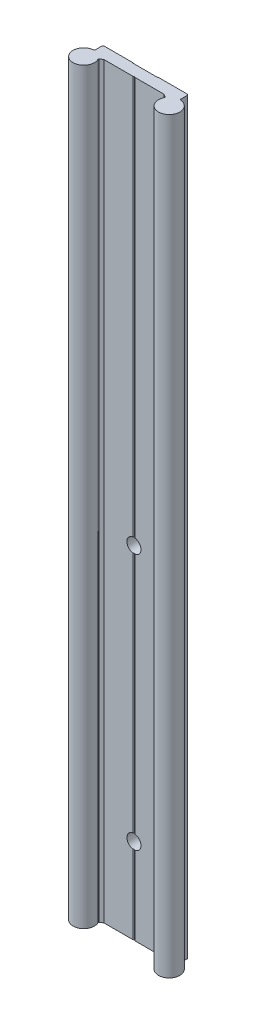
ISO-10303-21;
HEADER;
FILE_DESCRIPTION(('STEP AP214'),'2;1');
FILE_NAME('part.step','',(''),(''),'','','');
FILE_SCHEMA(('AUTOMOTIVE_DESIGN { 1 0 10303 214 1 1 1 1 }'));
ENDSEC;
DATA;
#1=APPLICATION_CONTEXT('core data for automotive mechanical design processes');
#2=APPLICATION_PROTOCOL_DEFINITION('international standard','automotive_design',2000,#1);
#3=PRODUCT_CONTEXT('',#1,'mechanical');
#4=PRODUCT('Part','Part','',(#3));
#5=PRODUCT_RELATED_PRODUCT_CATEGORY('part','',(#4));
#6=PRODUCT_DEFINITION_FORMATION('','',#4);
#7=PRODUCT_DEFINITION_CONTEXT('part definition',#1,'design');
#8=PRODUCT_DEFINITION('design','',#6,#7);
#9=PRODUCT_DEFINITION_SHAPE('','',#8);
#10=(LENGTH_UNIT() NAMED_UNIT(*) SI_UNIT(.MILLI.,.METRE.));
#11=(NAMED_UNIT(*) PLANE_ANGLE_UNIT() SI_UNIT($,.RADIAN.));
#12=(NAMED_UNIT(*) SI_UNIT($,.STERADIAN.) SOLID_ANGLE_UNIT());
#13=UNCERTAINTY_MEASURE_WITH_UNIT(LENGTH_MEASURE(1.E-05),#10,'distance_accuracy_value','');
#14=(GEOMETRIC_REPRESENTATION_CONTEXT(3) GLOBAL_UNCERTAINTY_ASSIGNED_CONTEXT((#13)) GLOBAL_UNIT_ASSIGNED_CONTEXT((#10,
#11,#12)) REPRESENTATION_CONTEXT('',''));
#15=CARTESIAN_POINT('',(0.,0.,0.));
#16=DIRECTION('',(0.,0.,1.));
#17=DIRECTION('',(1.,0.,0.));
#18=AXIS2_PLACEMENT_3D('',#15,#16,#17);
#19=CARTESIAN_POINT('',(19.75,0.,0.25));
#20=DIRECTION('',(0.707106781186548,0.,-0.707106781186548));
#21=DIRECTION('',(-0.707106781186548,0.,-0.707106781186548));
#22=AXIS2_PLACEMENT_3D('',#19,#20,#21);
#23=PLANE('',#22);
#24=DIRECTION('',(-0.707106781186548,0.,-0.707106781186548));
#25=VECTOR('',#24,1.);
#26=CARTESIAN_POINT('',(19.75,0.,0.25));
#27=LINE('',#26,#25);
#28=CARTESIAN_POINT('',(20.,0.,0.5));
#29=VERTEX_POINT('',#28);
#30=CARTESIAN_POINT('',(19.5,0.,0.));
#31=VERTEX_POINT('',#30);
#32=EDGE_CURVE('E123',#29,#31,#27,.T.);
#33=ORIENTED_EDGE('',*,*,#32,.T.);
#34=DIRECTION('',(0.,1.,0.));
#35=VECTOR('',#34,1.);
#36=CARTESIAN_POINT('',(19.5,0.,0.));
#37=LINE('',#36,#35);
#38=CARTESIAN_POINT('',(19.5,350.,0.));
#39=VERTEX_POINT('',#38);
#40=EDGE_CURVE('E376',#39,#31,#37,.F.);
#41=ORIENTED_EDGE('',*,*,#40,.F.);
#42=DIRECTION('',(-0.707106781186547,0.,-0.707106781186547));
#43=VECTOR('',#42,1.);
#44=CARTESIAN_POINT('',(20.,350.,0.5));
#45=LINE('',#44,#43);
#46=CARTESIAN_POINT('',(20.,350.,0.5));
#47=VERTEX_POINT('',#46);
#48=EDGE_CURVE('E293',#47,#39,#45,.T.);
#49=ORIENTED_EDGE('',*,*,#48,.F.);
#50=DIRECTION('',(0.,1.,0.));
#51=VECTOR('',#50,1.);
#52=CARTESIAN_POINT('',(20.,0.,0.5));
#53=LINE('',#52,#51);
#54=EDGE_CURVE('E368',#29,#47,#53,.T.);
#55=ORIENTED_EDGE('',*,*,#54,.F.);
#56=EDGE_LOOP('',(#33,#41,#49,#55));
#57=FACE_BOUND('',#56,.T.);
#58=ADVANCED_FACE('F32',(#57),#23,.T.);
#59=CARTESIAN_POINT('',(20.3,0.,3.70849738));
#60=DIRECTION('',(0.,1.,0.));
#61=DIRECTION('',(0.,0.,1.));
#62=AXIS2_PLACEMENT_3D('',#59,#60,#61);
#63=CYLINDRICAL_SURFACE('',#62,0.300000003500001);
#64=DIRECTION('',(0.,1.,0.));
#65=VECTOR('',#64,1.);
#66=CARTESIAN_POINT('',(20.2830188700676,0.,4.00801639874632));
#67=LINE('',#66,#65);
#68=CARTESIAN_POINT('',(20.2830188688936,0.,4.00801639929363));
#69=VERTEX_POINT('',#68);
#70=CARTESIAN_POINT('',(20.2830188689836,350.,4.00801639770649));
#71=VERTEX_POINT('',#70);
#72=EDGE_CURVE('E366',#69,#71,#67,.T.);
#73=ORIENTED_EDGE('',*,*,#72,.F.);
#74=CARTESIAN_POINT('',(20.3,0.,3.70849738));
#75=DIRECTION('',(0.,1.,0.));
#76=DIRECTION('',(0.,0.,1.));
#77=AXIS2_PLACEMENT_3D('',#74,#75,#76);
#78=CIRCLE('',#77,0.300000003500001);
#79=CARTESIAN_POINT('',(20.,0.,3.70849738));
#80=VERTEX_POINT('',#79);
#81=EDGE_CURVE('E35',#80,#69,#78,.T.);
#82=ORIENTED_EDGE('',*,*,#81,.F.);
#83=DIRECTION('',(0.,1.,0.));
#84=VECTOR('',#83,1.);
#85=CARTESIAN_POINT('',(20.,0.,3.70849738));
#86=LINE('',#85,#84);
#87=CARTESIAN_POINT('',(19.9999999982714,350.,3.70849738));
#88=VERTEX_POINT('',#87);
#89=EDGE_CURVE('E369',#88,#80,#86,.F.);
#90=ORIENTED_EDGE('',*,*,#89,.F.);
#91=CARTESIAN_POINT('',(20.3,350.,3.70849738));
#92=DIRECTION('',(0.,-1.,0.));
#93=DIRECTION('',(0.,0.,1.));
#94=AXIS2_PLACEMENT_3D('',#91,#92,#93);
#95=CIRCLE('',#94,0.300000001728561);
#96=EDGE_CURVE('E287',#71,#88,#95,.T.);
#97=ORIENTED_EDGE('',*,*,#96,.F.);
#98=EDGE_LOOP('',(#73,#82,#90,#97));
#99=FACE_BOUND('',#98,.T.);
#100=ADVANCED_FACE('F491',(#99),#63,.F.);
#101=CARTESIAN_POINT('',(15.28152165,0.,6.58629703));
#102=DIRECTION('',(0.,1.,0.));
#103=DIRECTION('',(0.,0.,1.));
#104=AXIS2_PLACEMENT_3D('',#101,#102,#103);
#105=CYLINDRICAL_SURFACE('',#104,0.299999998999998);
#106=DIRECTION('',(0.,1.,0.));
#107=VECTOR('',#106,1.);
#108=CARTESIAN_POINT('',(15.43152165,0.,6.32648941));
#109=LINE('',#108,#107);
#110=CARTESIAN_POINT('',(15.4315216497557,0.,6.32648940985894));
#111=VERTEX_POINT('',#110);
#112=CARTESIAN_POINT('',(15.4315216497557,350.,6.32648940985894));
#113=VERTEX_POINT('',#112);
#114=EDGE_CURVE('E411',#111,#113,#109,.T.);
#115=ORIENTED_EDGE('',*,*,#114,.F.);
#116=CARTESIAN_POINT('',(15.28152165,0.,6.58629703));
#117=DIRECTION('',(0.,1.,0.));
#118=DIRECTION('',(0.,0.,1.));
#119=AXIS2_PLACEMENT_3D('',#116,#117,#118);
#120=CIRCLE('',#119,0.299999998999998);
#121=CARTESIAN_POINT('',(15.5486053297196,0.,6.72292172801594));
#122=VERTEX_POINT('',#121);
#123=EDGE_CURVE('E417',#122,#111,#120,.T.);
#124=ORIENTED_EDGE('',*,*,#123,.F.);
#125=DIRECTION('',(0.,1.,0.));
#126=VECTOR('',#125,1.);
#127=CARTESIAN_POINT('',(15.5486053299831,0.,6.72292172999147));
#128=LINE('',#127,#126);
#129=CARTESIAN_POINT('',(15.5486053289735,350.,6.72292172763426));
#130=VERTEX_POINT('',#129);
#131=EDGE_CURVE('E363',#130,#122,#128,.F.);
#132=ORIENTED_EDGE('',*,*,#131,.F.);
#133=CARTESIAN_POINT('',(15.28152165,350.,6.58629703));
#134=DIRECTION('',(0.,-1.,0.));
#135=DIRECTION('',(0.,0.,1.));
#136=AXIS2_PLACEMENT_3D('',#133,#134,#135);
#137=CIRCLE('',#136,0.299999999296135);
#138=EDGE_CURVE('E281',#113,#130,#137,.T.);
#139=ORIENTED_EDGE('',*,*,#138,.F.);
#140=EDGE_LOOP('',(#115,#124,#132,#139));
#141=FACE_BOUND('',#140,.T.);
#142=ADVANCED_FACE('F499',(#141),#105,.F.);
#143=CARTESIAN_POINT('',(0.25,0.,5.355662435));
#144=DIRECTION('',(-0.499999994031163,0.,0.866025407230548));
#145=DIRECTION('',(0.866025407230548,0.,0.499999994031163));
#146=AXIS2_PLACEMENT_3D('',#143,#144,#145);
#147=PLANE('',#146);
#148=CARTESIAN_POINT('',(0.,40.,5.21132487));
#149=DIRECTION('',(-0.499999994031163,0.,0.866025407230548));
#150=DIRECTION('',(-0.866025407230548,0.,-0.499999994031163));
#151=AXIS2_PLACEMENT_3D('',#148,#149,#150);
#152=ELLIPSE('',#151,3.81051176148865,3.3);
#153=CARTESIAN_POINT('',(0.,43.3,5.21132487));
#154=VERTEX_POINT('',#153);
#155=CARTESIAN_POINT('',(0.499999999999999,43.26190128606,5.5));
#156=VERTEX_POINT('',#155);
#157=EDGE_CURVE('E390',#154,#156,#152,.F.);
#158=ORIENTED_EDGE('',*,*,#157,.T.);
#159=DIRECTION('',(0.,1.,0.));
#160=VECTOR('',#159,1.);
#161=CARTESIAN_POINT('',(0.5,0.,5.5));
#162=LINE('',#161,#160);
#163=CARTESIAN_POINT('',(0.499999999999999,156.73809871394,5.5));
#164=VERTEX_POINT('',#163);
#165=EDGE_CURVE('E359',#164,#156,#162,.F.);
#166=ORIENTED_EDGE('',*,*,#165,.F.);
#167=CARTESIAN_POINT('',(0.,160.,5.21132487));
#168=DIRECTION('',(-0.499999994031163,0.,0.866025407230548));
#169=DIRECTION('',(-0.866025407230548,0.,-0.499999994031163));
#170=AXIS2_PLACEMENT_3D('',#167,#168,#169);
#171=ELLIPSE('',#170,3.81051176148865,3.3);
#172=CARTESIAN_POINT('',(0.,156.7,5.21132487));
#173=VERTEX_POINT('',#172);
#174=EDGE_CURVE('E393',#164,#173,#171,.F.);
#175=ORIENTED_EDGE('',*,*,#174,.T.);
#176=DIRECTION('',(0.,1.,0.));
#177=VECTOR('',#176,1.);
#178=CARTESIAN_POINT('',(0.,0.,5.21132487));
#179=LINE('',#178,#177);
#180=EDGE_CURVE('E394',#154,#173,#179,.T.);
#181=ORIENTED_EDGE('',*,*,#180,.F.);
#182=EDGE_LOOP('',(#158,#166,#175,#181));
#183=FACE_BOUND('',#182,.T.);
#184=ADVANCED_FACE('F806',(#183),#147,.T.);
#185=CARTESIAN_POINT('',(0.25,0.,5.355662435));
#186=DIRECTION('',(-0.499999994031163,0.,0.866025407230548));
#187=DIRECTION('',(0.866025407230548,0.,0.499999994031163));
#188=AXIS2_PLACEMENT_3D('',#185,#186,#187);
#189=PLANE('',#188);
#190=DIRECTION('',(0.866025407230548,0.,0.499999994031163));
#191=VECTOR('',#190,1.);
#192=CARTESIAN_POINT('',(0.25,0.,5.355662435));
#193=LINE('',#192,#191);
#194=CARTESIAN_POINT('',(0.,0.,5.21132487));
#195=VERTEX_POINT('',#194);
#196=CARTESIAN_POINT('',(0.5,0.,5.5));
#197=VERTEX_POINT('',#196);
#198=EDGE_CURVE('E414',#195,#197,#193,.T.);
#199=ORIENTED_EDGE('',*,*,#198,.T.);
#200=DIRECTION('',(0.,1.,0.));
#201=VECTOR('',#200,1.);
#202=CARTESIAN_POINT('',(0.5,0.,5.5));
#203=LINE('',#202,#201);
#204=CARTESIAN_POINT('',(0.499999999999999,36.73809871394,5.5));
#205=VERTEX_POINT('',#204);
#206=EDGE_CURVE('E353',#205,#197,#203,.F.);
#207=ORIENTED_EDGE('',*,*,#206,.F.);
#208=CARTESIAN_POINT('',(0.,40.,5.21132487));
#209=DIRECTION('',(-0.499999994031163,0.,0.866025407230548));
#210=DIRECTION('',(-0.866025407230548,0.,-0.499999994031163));
#211=AXIS2_PLACEMENT_3D('',#208,#209,#210);
#212=ELLIPSE('',#211,3.81051176148865,3.3);
#213=CARTESIAN_POINT('',(0.,36.7,5.21132487));
#214=VERTEX_POINT('',#213);
#215=EDGE_CURVE('E476',#205,#214,#212,.F.);
#216=ORIENTED_EDGE('',*,*,#215,.T.);
#217=DIRECTION('',(0.,1.,0.));
#218=VECTOR('',#217,1.);
#219=CARTESIAN_POINT('',(0.,0.,5.21132487));
#220=LINE('',#219,#218);
#221=EDGE_CURVE('E399',#195,#214,#220,.T.);
#222=ORIENTED_EDGE('',*,*,#221,.F.);
#223=EDGE_LOOP('',(#199,#207,#216,#222));
#224=FACE_BOUND('',#223,.T.);
#225=ADVANCED_FACE('F510',(#224),#189,.T.);
#226=CARTESIAN_POINT('',(14.715760825,0.,5.913244705));
#227=DIRECTION('',(-0.500000000009856,0.,0.866025403778748));
#228=DIRECTION('',(0.866025403778748,0.,0.500000000009856));
#229=AXIS2_PLACEMENT_3D('',#226,#227,#228);
#230=PLANE('',#229);
#231=DIRECTION('',(0.866025403778748,0.,0.500000000009856));
#232=VECTOR('',#231,1.);
#233=CARTESIAN_POINT('',(14.715760825,0.,5.913244705));
#234=LINE('',#233,#232);
#235=CARTESIAN_POINT('',(14.,0.,5.5));
#236=VERTEX_POINT('',#235);
#237=EDGE_CURVE('E416',#236,#111,#234,.T.);
#238=ORIENTED_EDGE('',*,*,#237,.T.);
#239=ORIENTED_EDGE('',*,*,#114,.T.);
#240=DIRECTION('',(0.866025403778748,0.,0.500000000009856));
#241=VECTOR('',#240,1.);
#242=CARTESIAN_POINT('',(14.,350.,5.5));
#243=LINE('',#242,#241);
#244=CARTESIAN_POINT('',(14.,350.,5.5));
#245=VERTEX_POINT('',#244);
#246=EDGE_CURVE('E278',#245,#113,#243,.T.);
#247=ORIENTED_EDGE('',*,*,#246,.F.);
#248=DIRECTION('',(0.,1.,0.));
#249=VECTOR('',#248,1.);
#250=CARTESIAN_POINT('',(14.,0.,5.5));
#251=LINE('',#250,#249);
#252=EDGE_CURVE('E350',#236,#245,#251,.T.);
#253=ORIENTED_EDGE('',*,*,#252,.F.);
#254=EDGE_LOOP('',(#238,#239,#247,#253));
#255=FACE_BOUND('',#254,.T.);
#256=ADVANCED_FACE('F502',(#255),#230,.T.);
#257=CARTESIAN_POINT('',(0.25,0.,5.355662435));
#258=DIRECTION('',(-0.499999994031163,0.,0.866025407230548));
#259=DIRECTION('',(0.866025407230548,0.,0.499999994031163));
#260=AXIS2_PLACEMENT_3D('',#257,#258,#259);
#261=PLANE('',#260);
#262=DIRECTION('',(0.,1.,0.));
#263=VECTOR('',#262,1.);
#264=CARTESIAN_POINT('',(0.5,0.,5.5));
#265=LINE('',#264,#263);
#266=CARTESIAN_POINT('',(0.5,350.,5.5));
#267=VERTEX_POINT('',#266);
#268=CARTESIAN_POINT('',(0.499999999999999,163.26190128606,5.5));
#269=VERTEX_POINT('',#268);
#270=EDGE_CURVE('E347',#267,#269,#265,.F.);
#271=ORIENTED_EDGE('',*,*,#270,.F.);
#272=DIRECTION('',(0.866025407230549,0.,0.499999994031162));
#273=VECTOR('',#272,1.);
#274=CARTESIAN_POINT('',(0.,350.,5.21132487));
#275=LINE('',#274,#273);
#276=CARTESIAN_POINT('',(0.,350.,5.21132487));
#277=VERTEX_POINT('',#276);
#278=EDGE_CURVE('E272',#277,#267,#275,.T.);
#279=ORIENTED_EDGE('',*,*,#278,.F.);
#280=DIRECTION('',(0.,1.,0.));
#281=VECTOR('',#280,1.);
#282=CARTESIAN_POINT('',(0.,0.,5.21132487));
#283=LINE('',#282,#281);
#284=CARTESIAN_POINT('',(0.,163.3,5.21132487));
#285=VERTEX_POINT('',#284);
#286=EDGE_CURVE('E407',#285,#277,#283,.T.);
#287=ORIENTED_EDGE('',*,*,#286,.F.);
#288=CARTESIAN_POINT('',(0.,160.,5.21132487));
#289=DIRECTION('',(-0.499999994031163,0.,0.866025407230548));
#290=DIRECTION('',(-0.866025407230548,0.,-0.499999994031163));
#291=AXIS2_PLACEMENT_3D('',#288,#289,#290);
#292=ELLIPSE('',#291,3.81051176148865,3.3);
#293=EDGE_CURVE('E478',#285,#269,#292,.F.);
#294=ORIENTED_EDGE('',*,*,#293,.T.);
#295=EDGE_LOOP('',(#271,#279,#287,#294));
#296=FACE_BOUND('',#295,.T.);
#297=ADVANCED_FACE('F594',(#296),#261,.T.);
#298=CARTESIAN_POINT('',(-0.25,0.,5.355662435));
#299=DIRECTION('',(0.499999994031163,0.,0.866025407230548));
#300=DIRECTION('',(0.866025407230548,0.,-0.499999994031163));
#301=AXIS2_PLACEMENT_3D('',#298,#299,#300);
#302=PLANE('',#301);
#303=ORIENTED_EDGE('',*,*,#286,.T.);
#304=DIRECTION('',(0.866025407230549,0.,-0.499999994031162));
#305=VECTOR('',#304,1.);
#306=CARTESIAN_POINT('',(-0.5,350.,5.5));
#307=LINE('',#306,#305);
#308=CARTESIAN_POINT('',(-0.5,350.,5.5));
#309=VERTEX_POINT('',#308);
#310=EDGE_CURVE('E269',#309,#277,#307,.T.);
#311=ORIENTED_EDGE('',*,*,#310,.F.);
#312=DIRECTION('',(0.,1.,0.));
#313=VECTOR('',#312,1.);
#314=CARTESIAN_POINT('',(-0.5,0.,5.5));
#315=LINE('',#314,#313);
#316=CARTESIAN_POINT('',(-0.499999999999999,163.26190128606,5.5));
#317=VERTEX_POINT('',#316);
#318=EDGE_CURVE('E342',#317,#309,#315,.T.);
#319=ORIENTED_EDGE('',*,*,#318,.F.);
#320=CARTESIAN_POINT('',(0.,160.,5.21132487));
#321=DIRECTION('',(0.499999994031163,0.,0.866025407230548));
#322=DIRECTION('',(0.866025407230548,0.,-0.499999994031163));
#323=AXIS2_PLACEMENT_3D('',#320,#321,#322);
#324=ELLIPSE('',#323,3.81051176148865,3.3);
#325=EDGE_CURVE('E481',#317,#285,#324,.F.);
#326=ORIENTED_EDGE('',*,*,#325,.T.);
#327=EDGE_LOOP('',(#303,#311,#319,#326));
#328=FACE_BOUND('',#327,.T.);
#329=ADVANCED_FACE('F602',(#328),#302,.T.);
#330=CARTESIAN_POINT('',(-0.25,0.,5.355662435));
#331=DIRECTION('',(0.499999994031163,0.,0.866025407230548));
#332=DIRECTION('',(0.866025407230548,0.,-0.499999994031163));
#333=AXIS2_PLACEMENT_3D('',#330,#331,#332);
#334=PLANE('',#333);
#335=DIRECTION('',(0.866025407230548,0.,-0.499999994031163));
#336=VECTOR('',#335,1.);
#337=CARTESIAN_POINT('',(-0.25,0.,5.355662435));
#338=LINE('',#337,#336);
#339=CARTESIAN_POINT('',(-0.5,0.,5.5));
#340=VERTEX_POINT('',#339);
#341=EDGE_CURVE('E402',#340,#195,#338,.T.);
#342=ORIENTED_EDGE('',*,*,#341,.T.);
#343=ORIENTED_EDGE('',*,*,#221,.T.);
#344=CARTESIAN_POINT('',(0.,40.,5.21132487));
#345=DIRECTION('',(0.499999994031163,0.,0.866025407230548));
#346=DIRECTION('',(0.866025407230548,0.,-0.499999994031163));
#347=AXIS2_PLACEMENT_3D('',#344,#345,#346);
#348=ELLIPSE('',#347,3.81051176148865,3.3);
#349=CARTESIAN_POINT('',(-0.499999999999999,36.73809871394,5.5));
#350=VERTEX_POINT('',#349);
#351=EDGE_CURVE('E473',#214,#350,#348,.F.);
#352=ORIENTED_EDGE('',*,*,#351,.T.);
#353=DIRECTION('',(0.,1.,0.));
#354=VECTOR('',#353,1.);
#355=CARTESIAN_POINT('',(-0.5,0.,5.5));
#356=LINE('',#355,#354);
#357=EDGE_CURVE('E336',#340,#350,#356,.T.);
#358=ORIENTED_EDGE('',*,*,#357,.F.);
#359=EDGE_LOOP('',(#342,#343,#352,#358));
#360=FACE_BOUND('',#359,.T.);
#361=ADVANCED_FACE('F514',(#360),#334,.T.);
#362=CARTESIAN_POINT('',(-0.25,0.,5.355662435));
#363=DIRECTION('',(0.499999994031163,0.,0.866025407230548));
#364=DIRECTION('',(0.866025407230548,0.,-0.499999994031163));
#365=AXIS2_PLACEMENT_3D('',#362,#363,#364);
#366=PLANE('',#365);
#367=CARTESIAN_POINT('',(0.,40.,5.21132487));
#368=DIRECTION('',(0.499999994031163,0.,0.866025407230548));
#369=DIRECTION('',(0.866025407230548,0.,-0.499999994031163));
#370=AXIS2_PLACEMENT_3D('',#367,#368,#369);
#371=ELLIPSE('',#370,3.81051176148865,3.3);
#372=CARTESIAN_POINT('',(-0.499999999999999,43.26190128606,5.5));
#373=VERTEX_POINT('',#372);
#374=EDGE_CURVE('E470',#373,#154,#371,.F.);
#375=ORIENTED_EDGE('',*,*,#374,.T.);
#376=ORIENTED_EDGE('',*,*,#180,.T.);
#377=CARTESIAN_POINT('',(0.,160.,5.21132487));
#378=DIRECTION('',(0.499999994031163,0.,0.866025407230548));
#379=DIRECTION('',(0.866025407230548,0.,-0.499999994031163));
#380=AXIS2_PLACEMENT_3D('',#377,#378,#379);
#381=ELLIPSE('',#380,3.81051176148865,3.3);
#382=CARTESIAN_POINT('',(-0.499999999999999,156.73809871394,5.5));
#383=VERTEX_POINT('',#382);
#384=EDGE_CURVE('E484',#173,#383,#381,.F.);
#385=ORIENTED_EDGE('',*,*,#384,.T.);
#386=DIRECTION('',(0.,1.,0.));
#387=VECTOR('',#386,1.);
#388=CARTESIAN_POINT('',(-0.5,0.,5.5));
#389=LINE('',#388,#387);
#390=EDGE_CURVE('E326',#373,#383,#389,.T.);
#391=ORIENTED_EDGE('',*,*,#390,.F.);
#392=EDGE_LOOP('',(#375,#376,#385,#391));
#393=FACE_BOUND('',#392,.T.);
#394=ADVANCED_FACE('F615',(#393),#366,.T.);
#395=CARTESIAN_POINT('',(-19.75,0.,0.25));
#396=DIRECTION('',(-0.707106781186548,0.,-0.707106781186548));
#397=DIRECTION('',(-0.707106781186548,0.,0.707106781186548));
#398=AXIS2_PLACEMENT_3D('',#395,#396,#397);
#399=PLANE('',#398);
#400=DIRECTION('',(-0.707106781186548,0.,0.707106781186548));
#401=VECTOR('',#400,1.);
#402=CARTESIAN_POINT('',(-19.75,0.,0.25));
#403=LINE('',#402,#401);
#404=CARTESIAN_POINT('',(-19.5,0.,0.));
#405=VERTEX_POINT('',#404);
#406=CARTESIAN_POINT('',(-20.,0.,0.5));
#407=VERTEX_POINT('',#406);
#408=EDGE_CURVE('E391',#405,#407,#403,.T.);
#409=ORIENTED_EDGE('',*,*,#408,.T.);
#410=DIRECTION('',(0.,1.,0.));
#411=VECTOR('',#410,1.);
#412=CARTESIAN_POINT('',(-20.,0.,0.5));
#413=LINE('',#412,#411);
#414=CARTESIAN_POINT('',(-20.,350.,0.5));
#415=VERTEX_POINT('',#414);
#416=EDGE_CURVE('E323',#415,#407,#413,.F.);
#417=ORIENTED_EDGE('',*,*,#416,.F.);
#418=DIRECTION('',(-0.707106781186548,0.,0.707106781186547));
#419=VECTOR('',#418,1.);
#420=CARTESIAN_POINT('',(-19.5,350.,0.));
#421=LINE('',#420,#419);
#422=CARTESIAN_POINT('',(-19.5,350.,0.));
#423=VERTEX_POINT('',#422);
#424=EDGE_CURVE('E248',#423,#415,#421,.T.);
#425=ORIENTED_EDGE('',*,*,#424,.F.);
#426=DIRECTION('',(0.,1.,0.));
#427=VECTOR('',#426,1.);
#428=CARTESIAN_POINT('',(-19.5,0.,0.));
#429=LINE('',#428,#427);
#430=EDGE_CURVE('E320',#405,#423,#429,.T.);
#431=ORIENTED_EDGE('',*,*,#430,.F.);
#432=EDGE_LOOP('',(#409,#417,#425,#431));
#433=FACE_BOUND('',#432,.T.);
#434=ADVANCED_FACE('F542',(#433),#399,.T.);
#435=CARTESIAN_POINT('',(0.,160.,2.85));
#436=DIRECTION('',(0.,0.,-1.));
#437=DIRECTION('',(-1.,0.,0.));
#438=AXIS2_PLACEMENT_3D('',#435,#436,#437);
#439=CYLINDRICAL_SURFACE('',#438,3.3);
#440=CARTESIAN_POINT('',(0.,160.,5.5));
#441=DIRECTION('',(0.,0.,-1.));
#442=DIRECTION('',(-1.,0.,0.));
#443=AXIS2_PLACEMENT_3D('',#440,#441,#442);
#444=CIRCLE('',#443,3.3);
#445=EDGE_CURVE('E344',#383,#317,#444,.T.);
#446=ORIENTED_EDGE('',*,*,#445,.F.);
#447=ORIENTED_EDGE('',*,*,#384,.F.);
#448=ORIENTED_EDGE('',*,*,#174,.F.);
#449=CARTESIAN_POINT('',(0.,160.,5.5));
#450=DIRECTION('',(0.,0.,-1.));
#451=DIRECTION('',(-1.,0.,0.));
#452=AXIS2_PLACEMENT_3D('',#449,#450,#451);
#453=CIRCLE('',#452,3.3);
#454=EDGE_CURVE('E362',#269,#164,#453,.T.);
#455=ORIENTED_EDGE('',*,*,#454,.F.);
#456=ORIENTED_EDGE('',*,*,#293,.F.);
#457=ORIENTED_EDGE('',*,*,#325,.F.);
#458=EDGE_LOOP('',(#446,#447,#448,#455,#456,#457));
#459=FACE_BOUND('',#458,.T.);
#460=CARTESIAN_POINT('',(0.,160.,0.2));
#461=DIRECTION('',(0.,0.,-1.));
#462=DIRECTION('',(-1.,0.,0.));
#463=AXIS2_PLACEMENT_3D('',#460,#461,#462);
#464=CIRCLE('',#463,3.3);
#465=CARTESIAN_POINT('',(-3.3,160.,0.2));
#466=VERTEX_POINT('',#465);
#467=EDGE_CURVE('E428',#466,#466,#464,.F.);
#468=ORIENTED_EDGE('',*,*,#467,.F.);
#469=EDGE_LOOP('',(#468));
#470=FACE_BOUND('',#469,.T.);
#471=ADVANCED_FACE('F636',(#459,#470),#439,.F.);
#472=CARTESIAN_POINT('',(0.,40.,2.85));
#473=DIRECTION('',(0.,0.,-1.));
#474=DIRECTION('',(-1.,0.,0.));
#475=AXIS2_PLACEMENT_3D('',#472,#473,#474);
#476=CYLINDRICAL_SURFACE('',#475,3.3);
#477=CARTESIAN_POINT('',(0.,40.,5.5));
#478=DIRECTION('',(0.,0.,-1.));
#479=DIRECTION('',(-1.,0.,0.));
#480=AXIS2_PLACEMENT_3D('',#477,#478,#479);
#481=CIRCLE('',#480,3.3);
#482=EDGE_CURVE('E335',#350,#373,#481,.T.);
#483=ORIENTED_EDGE('',*,*,#482,.F.);
#484=ORIENTED_EDGE('',*,*,#351,.F.);
#485=ORIENTED_EDGE('',*,*,#215,.F.);
#486=CARTESIAN_POINT('',(0.,40.,5.5));
#487=DIRECTION('',(0.,0.,-1.));
#488=DIRECTION('',(-1.,0.,0.));
#489=AXIS2_PLACEMENT_3D('',#486,#487,#488);
#490=CIRCLE('',#489,3.3);
#491=EDGE_CURVE('E356',#156,#205,#490,.T.);
#492=ORIENTED_EDGE('',*,*,#491,.F.);
#493=ORIENTED_EDGE('',*,*,#157,.F.);
#494=ORIENTED_EDGE('',*,*,#374,.F.);
#495=EDGE_LOOP('',(#483,#484,#485,#492,#493,#494));
#496=FACE_BOUND('',#495,.T.);
#497=CARTESIAN_POINT('',(0.,40.,0.2));
#498=DIRECTION('',(0.,0.,-1.));
#499=DIRECTION('',(-1.,0.,0.));
#500=AXIS2_PLACEMENT_3D('',#497,#498,#499);
#501=CIRCLE('',#500,3.3);
#502=CARTESIAN_POINT('',(-3.3,40.,0.2));
#503=VERTEX_POINT('',#502);
#504=EDGE_CURVE('E318',#503,#503,#501,.F.);
#505=ORIENTED_EDGE('',*,*,#504,.F.);
#506=EDGE_LOOP('',(#505));
#507=FACE_BOUND('',#506,.T.);
#508=ADVANCED_FACE('F650',(#496,#507),#476,.F.);
#509=CARTESIAN_POINT('',(5.9,0.,0.1));
#510=DIRECTION('',(-0.707106781186547,0.,-0.707106781186548));
#511=DIRECTION('',(-0.707106781186548,0.,0.707106781186547));
#512=AXIS2_PLACEMENT_3D('',#509,#510,#511);
#513=PLANE('',#512);
#514=DIRECTION('',(-0.707106781186548,0.,0.707106781186547));
#515=VECTOR('',#514,1.);
#516=CARTESIAN_POINT('',(5.9,0.,0.1));
#517=LINE('',#516,#515);
#518=CARTESIAN_POINT('',(6.,0.,0.));
#519=VERTEX_POINT('',#518);
#520=CARTESIAN_POINT('',(5.8,0.,0.2));
#521=VERTEX_POINT('',#520);
#522=EDGE_CURVE('E388',#519,#521,#517,.T.);
#523=ORIENTED_EDGE('',*,*,#522,.T.);
#524=DIRECTION('',(0.,1.,0.));
#525=VECTOR('',#524,1.);
#526=CARTESIAN_POINT('',(5.8,0.,0.2));
#527=LINE('',#526,#525);
#528=CARTESIAN_POINT('',(5.8,350.,0.2));
#529=VERTEX_POINT('',#528);
#530=EDGE_CURVE('E228',#529,#521,#527,.F.);
#531=ORIENTED_EDGE('',*,*,#530,.F.);
#532=DIRECTION('',(-0.707106781186549,0.,0.707106781186546));
#533=VECTOR('',#532,1.);
#534=CARTESIAN_POINT('',(6.,350.,0.));
#535=LINE('',#534,#533);
#536=CARTESIAN_POINT('',(6.,350.,0.));
#537=VERTEX_POINT('',#536);
#538=EDGE_CURVE('E244',#537,#529,#535,.T.);
#539=ORIENTED_EDGE('',*,*,#538,.F.);
#540=DIRECTION('',(0.,1.,0.));
#541=VECTOR('',#540,1.);
#542=CARTESIAN_POINT('',(6.,0.,0.));
#543=LINE('',#542,#541);
#544=EDGE_CURVE('E371',#519,#537,#543,.T.);
#545=ORIENTED_EDGE('',*,*,#544,.F.);
#546=EDGE_LOOP('',(#523,#531,#539,#545));
#547=FACE_BOUND('',#546,.T.);
#548=ADVANCED_FACE('F644',(#547),#513,.T.);
#549=CARTESIAN_POINT('',(-5.9,0.,0.1));
#550=DIRECTION('',(0.707106781186547,0.,-0.707106781186548));
#551=DIRECTION('',(-0.707106781186548,0.,-0.707106781186547));
#552=AXIS2_PLACEMENT_3D('',#549,#550,#551);
#553=PLANE('',#552);
#554=DIRECTION('',(-0.707106781186548,0.,-0.707106781186547));
#555=VECTOR('',#554,1.);
#556=CARTESIAN_POINT('',(-5.9,0.,0.1));
#557=LINE('',#556,#555);
#558=CARTESIAN_POINT('',(-5.8,0.,0.2));
#559=VERTEX_POINT('',#558);
#560=CARTESIAN_POINT('',(-6.,0.,0.));
#561=VERTEX_POINT('',#560);
#562=EDGE_CURVE('E385',#559,#561,#557,.T.);
#563=ORIENTED_EDGE('',*,*,#562,.T.);
#564=DIRECTION('',(0.,1.,0.));
#565=VECTOR('',#564,1.);
#566=CARTESIAN_POINT('',(-6.,0.,0.));
#567=LINE('',#566,#565);
#568=CARTESIAN_POINT('',(-6.,350.,0.));
#569=VERTEX_POINT('',#568);
#570=EDGE_CURVE('E234',#569,#561,#567,.F.);
#571=ORIENTED_EDGE('',*,*,#570,.F.);
#572=DIRECTION('',(-0.707106781186549,0.,-0.707106781186546));
#573=VECTOR('',#572,1.);
#574=CARTESIAN_POINT('',(-5.8,350.,0.2));
#575=LINE('',#574,#573);
#576=CARTESIAN_POINT('',(-5.8,350.,0.2));
#577=VERTEX_POINT('',#576);
#578=EDGE_CURVE('E231',#577,#569,#575,.T.);
#579=ORIENTED_EDGE('',*,*,#578,.F.);
#580=DIRECTION('',(0.,1.,0.));
#581=VECTOR('',#580,1.);
#582=CARTESIAN_POINT('',(-5.8,0.,0.2));
#583=LINE('',#582,#581);
#584=EDGE_CURVE('E217',#559,#577,#583,.T.);
#585=ORIENTED_EDGE('',*,*,#584,.F.);
#586=EDGE_LOOP('',(#563,#571,#579,#585));
#587=FACE_BOUND('',#586,.T.);
#588=ADVANCED_FACE('F232',(#587),#553,.T.);
#589=CARTESIAN_POINT('',(-20.3,0.,3.70849738));
#590=DIRECTION('',(0.,1.,0.));
#591=DIRECTION('',(0.,0.,1.));
#592=AXIS2_PLACEMENT_3D('',#589,#590,#591);
#593=CYLINDRICAL_SURFACE('',#592,0.299999999999997);
#594=DIRECTION('',(0.,1.,0.));
#595=VECTOR('',#594,1.);
#596=CARTESIAN_POINT('',(-20.,0.,3.70849738));
#597=LINE('',#596,#595);
#598=CARTESIAN_POINT('',(-20.,0.,3.70849738));
#599=VERTEX_POINT('',#598);
#600=CARTESIAN_POINT('',(-20.,350.,3.70849738));
#601=VERTEX_POINT('',#600);
#602=EDGE_CURVE('E321',#599,#601,#597,.T.);
#603=ORIENTED_EDGE('',*,*,#602,.F.);
#604=CARTESIAN_POINT('',(-20.3,0.,3.70849738));
#605=DIRECTION('',(0.,1.,0.));
#606=DIRECTION('',(0.,0.,1.));
#607=AXIS2_PLACEMENT_3D('',#604,#605,#606);
#608=CIRCLE('',#607,0.299999999999997);
#609=CARTESIAN_POINT('',(-20.2830188689741,0.,4.00801639818839));
#610=VERTEX_POINT('',#609);
#611=EDGE_CURVE('E387',#610,#599,#608,.T.);
#612=ORIENTED_EDGE('',*,*,#611,.F.);
#613=DIRECTION('',(0.,1.,0.));
#614=VECTOR('',#613,1.);
#615=CARTESIAN_POINT('',(-20.2830188699984,0.,4.00801640002843));
#616=LINE('',#615,#614);
#617=CARTESIAN_POINT('',(-20.2830188690496,350.,4.00801639685621));
#618=VERTEX_POINT('',#617);
#619=EDGE_CURVE('E227',#618,#610,#616,.F.);
#620=ORIENTED_EDGE('',*,*,#619,.F.);
#621=CARTESIAN_POINT('',(-20.3,350.,3.70849738));
#622=DIRECTION('',(0.,-1.,0.));
#623=DIRECTION('',(0.,0.,1.));
#624=AXIS2_PLACEMENT_3D('',#621,#622,#623);
#625=CIRCLE('',#624,0.300000000444776);
#626=EDGE_CURVE('E254',#601,#618,#625,.T.);
#627=ORIENTED_EDGE('',*,*,#626,.F.);
#628=EDGE_LOOP('',(#603,#612,#620,#627));
#629=FACE_BOUND('',#628,.T.);
#630=ADVANCED_FACE('F533',(#629),#593,.F.);
#631=CARTESIAN_POINT('',(-14.715760825,0.,5.91324470499998));
#632=DIRECTION('',(0.500000000009856,0.,0.866025403778748));
#633=DIRECTION('',(0.866025403778748,0.,-0.500000000009856));
#634=AXIS2_PLACEMENT_3D('',#631,#632,#633);
#635=PLANE('',#634);
#636=DIRECTION('',(-0.866025404469381,0.,0.499999998813646));
#637=VECTOR('',#636,1.);
#638=CARTESIAN_POINT('',(-14.,0.,5.5));
#639=LINE('',#638,#637);
#640=CARTESIAN_POINT('',(-14.,0.,5.5));
#641=VERTEX_POINT('',#640);
#642=CARTESIAN_POINT('',(-15.4315216507178,0.,6.326489407778));
#643=VERTEX_POINT('',#642);
#644=EDGE_CURVE('E303',#641,#643,#639,.T.);
#645=ORIENTED_EDGE('',*,*,#644,.F.);
#646=DIRECTION('',(0.,1.,0.));
#647=VECTOR('',#646,1.);
#648=CARTESIAN_POINT('',(-14.,0.,5.5));
#649=LINE('',#648,#647);
#650=CARTESIAN_POINT('',(-14.,350.,5.5));
#651=VERTEX_POINT('',#650);
#652=EDGE_CURVE('E339',#651,#641,#649,.F.);
#653=ORIENTED_EDGE('',*,*,#652,.F.);
#654=DIRECTION('',(0.866025403980827,0.,-0.499999999659846));
#655=VECTOR('',#654,1.);
#656=CARTESIAN_POINT('',(-15.4315216500897,350.,6.32648940928034));
#657=LINE('',#656,#655);
#658=CARTESIAN_POINT('',(-15.4315216494878,350.,6.3264894103228));
#659=VERTEX_POINT('',#658);
#660=EDGE_CURVE('E263',#659,#651,#657,.T.);
#661=ORIENTED_EDGE('',*,*,#660,.F.);
#662=DIRECTION('',(0.,1.,0.));
#663=VECTOR('',#662,1.);
#664=CARTESIAN_POINT('',(-15.4315216511415,0.,6.32648940802261));
#665=LINE('',#664,#663);
#666=EDGE_CURVE('E331',#659,#643,#665,.F.);
#667=ORIENTED_EDGE('',*,*,#666,.T.);
#668=EDGE_LOOP('',(#645,#653,#661,#667));
#669=FACE_BOUND('',#668,.T.);
#670=ADVANCED_FACE('F522',(#669),#635,.T.);
#671=CARTESIAN_POINT('',(12.75,0.,0.));
#672=DIRECTION('',(0.,0.,-1.));
#673=DIRECTION('',(-1.,0.,0.));
#674=AXIS2_PLACEMENT_3D('',#671,#672,#673);
#675=PLANE('',#674);
#676=DIRECTION('',(1.,0.,0.));
#677=VECTOR('',#676,1.);
#678=CARTESIAN_POINT('',(-7.7796083811088E-09,0.,0.));
#679=LINE('',#678,#677);
#680=EDGE_CURVE('E313',#519,#31,#679,.T.);
#681=ORIENTED_EDGE('',*,*,#680,.F.);
#682=ORIENTED_EDGE('',*,*,#544,.T.);
#683=DIRECTION('',(-1.,0.,0.));
#684=VECTOR('',#683,1.);
#685=CARTESIAN_POINT('',(19.5,350.,0.));
#686=LINE('',#685,#684);
#687=EDGE_CURVE('E296',#39,#537,#686,.T.);
#688=ORIENTED_EDGE('',*,*,#687,.F.);
#689=ORIENTED_EDGE('',*,*,#40,.T.);
#690=EDGE_LOOP('',(#681,#682,#688,#689));
#691=FACE_BOUND('',#690,.T.);
#692=ADVANCED_FACE('F683',(#691),#675,.T.);
#693=CARTESIAN_POINT('',(20.,0.,2.10424869));
#694=DIRECTION('',(1.,0.,0.));
#695=DIRECTION('',(0.,0.,-1.));
#696=AXIS2_PLACEMENT_3D('',#693,#694,#695);
#697=PLANE('',#696);
#698=DIRECTION('',(0.,0.,-1.));
#699=VECTOR('',#698,1.);
#700=CARTESIAN_POINT('',(20.,0.,5.21921116449749));
#701=LINE('',#700,#699);
#702=EDGE_CURVE('E310',#29,#80,#701,.F.);
#703=ORIENTED_EDGE('',*,*,#702,.F.);
#704=ORIENTED_EDGE('',*,*,#54,.T.);
#705=DIRECTION('',(4.49916864020629E-10,0.,-1.));
#706=VECTOR('',#705,1.);
#707=CARTESIAN_POINT('',(19.9999999985564,350.,3.70849738));
#708=LINE('',#707,#706);
#709=EDGE_CURVE('E290',#88,#47,#708,.T.);
#710=ORIENTED_EDGE('',*,*,#709,.F.);
#711=ORIENTED_EDGE('',*,*,#89,.T.);
#712=EDGE_LOOP('',(#703,#704,#710,#711));
#713=FACE_BOUND('',#712,.T.);
#714=ADVANCED_FACE('F694',(#713),#697,.T.);
#715=CARTESIAN_POINT('',(20.,0.,9.00000000000001));
#716=DIRECTION('',(0.,1.,0.));
#717=DIRECTION('',(0.,0.,1.));
#718=AXIS2_PLACEMENT_3D('',#715,#716,#717);
#719=CYLINDRICAL_SURFACE('',#718,4.99999999560001);
#720=ORIENTED_EDGE('',*,*,#131,.T.);
#721=CARTESIAN_POINT('',(20.,0.,9.00000000000001));
#722=DIRECTION('',(0.,1.,0.));
#723=DIRECTION('',(0.,0.,1.));
#724=AXIS2_PLACEMENT_3D('',#721,#722,#723);
#725=CIRCLE('',#724,4.99999999560001);
#726=EDGE_CURVE('E312',#69,#122,#725,.F.);
#727=ORIENTED_EDGE('',*,*,#726,.F.);
#728=ORIENTED_EDGE('',*,*,#72,.T.);
#729=CARTESIAN_POINT('',(20.,350.,9.00000000000001));
#730=DIRECTION('',(0.,1.,0.));
#731=DIRECTION('',(0.,0.,1.));
#732=AXIS2_PLACEMENT_3D('',#729,#730,#731);
#733=CIRCLE('',#732,4.99999999657682);
#734=EDGE_CURVE('E284',#130,#71,#733,.T.);
#735=ORIENTED_EDGE('',*,*,#734,.F.);
#736=EDGE_LOOP('',(#720,#727,#728,#735));
#737=FACE_BOUND('',#736,.T.);
#738=ADVANCED_FACE('F494',(#737),#719,.T.);
#739=CARTESIAN_POINT('',(7.25,0.,5.5));
#740=DIRECTION('',(0.,0.,1.));
#741=DIRECTION('',(1.,0.,0.));
#742=AXIS2_PLACEMENT_3D('',#739,#740,#741);
#743=PLANE('',#742);
#744=ORIENTED_EDGE('',*,*,#252,.T.);
#745=DIRECTION('',(1.,0.,0.));
#746=VECTOR('',#745,1.);
#747=CARTESIAN_POINT('',(0.5,350.,5.5));
#748=LINE('',#747,#746);
#749=EDGE_CURVE('E275',#267,#245,#748,.T.);
#750=ORIENTED_EDGE('',*,*,#749,.F.);
#751=ORIENTED_EDGE('',*,*,#270,.T.);
#752=ORIENTED_EDGE('',*,*,#454,.T.);
#753=ORIENTED_EDGE('',*,*,#165,.T.);
#754=ORIENTED_EDGE('',*,*,#491,.T.);
#755=ORIENTED_EDGE('',*,*,#206,.T.);
#756=DIRECTION('',(1.,0.,0.));
#757=VECTOR('',#756,1.);
#758=CARTESIAN_POINT('',(-7.7796083811088E-09,0.,5.5));
#759=LINE('',#758,#757);
#760=EDGE_CURVE('E379',#236,#197,#759,.F.);
#761=ORIENTED_EDGE('',*,*,#760,.F.);
#762=EDGE_LOOP('',(#744,#750,#751,#752,#753,#754,#755,#761));
#763=FACE_BOUND('',#762,.T.);
#764=ADVANCED_FACE('F506',(#763),#743,.T.);
#765=CARTESIAN_POINT('',(-7.25,0.,5.5));
#766=DIRECTION('',(0.,0.,1.));
#767=DIRECTION('',(1.,0.,0.));
#768=AXIS2_PLACEMENT_3D('',#765,#766,#767);
#769=PLANE('',#768);
#770=ORIENTED_EDGE('',*,*,#482,.T.);
#771=ORIENTED_EDGE('',*,*,#390,.T.);
#772=ORIENTED_EDGE('',*,*,#445,.T.);
#773=ORIENTED_EDGE('',*,*,#318,.T.);
#774=DIRECTION('',(1.,0.,0.));
#775=VECTOR('',#774,1.);
#776=CARTESIAN_POINT('',(-14.,350.,5.5));
#777=LINE('',#776,#775);
#778=EDGE_CURVE('E266',#651,#309,#777,.T.);
#779=ORIENTED_EDGE('',*,*,#778,.F.);
#780=ORIENTED_EDGE('',*,*,#652,.T.);
#781=DIRECTION('',(1.,0.,0.));
#782=VECTOR('',#781,1.);
#783=CARTESIAN_POINT('',(-7.7796083811088E-09,0.,5.5));
#784=LINE('',#783,#782);
#785=EDGE_CURVE('E307',#340,#641,#784,.F.);
#786=ORIENTED_EDGE('',*,*,#785,.F.);
#787=ORIENTED_EDGE('',*,*,#357,.T.);
#788=EDGE_LOOP('',(#770,#771,#772,#773,#779,#780,#786,#787));
#789=FACE_BOUND('',#788,.T.);
#790=ADVANCED_FACE('F518',(#789),#769,.T.);
#791=CARTESIAN_POINT('',(-20.,0.,2.10424869));
#792=DIRECTION('',(-1.,0.,0.));
#793=DIRECTION('',(0.,0.,1.));
#794=AXIS2_PLACEMENT_3D('',#791,#792,#793);
#795=PLANE('',#794);
#796=DIRECTION('',(0.,0.,-1.));
#797=VECTOR('',#796,1.);
#798=CARTESIAN_POINT('',(-20.,0.,5.21921116449749));
#799=LINE('',#798,#797);
#800=EDGE_CURVE('E299',#599,#407,#799,.T.);
#801=ORIENTED_EDGE('',*,*,#800,.F.);
#802=ORIENTED_EDGE('',*,*,#602,.T.);
#803=DIRECTION('',(0.,0.,1.));
#804=VECTOR('',#803,1.);
#805=CARTESIAN_POINT('',(-20.,350.,0.5));
#806=LINE('',#805,#804);
#807=EDGE_CURVE('E251',#415,#601,#806,.T.);
#808=ORIENTED_EDGE('',*,*,#807,.F.);
#809=ORIENTED_EDGE('',*,*,#416,.T.);
#810=EDGE_LOOP('',(#801,#802,#808,#809));
#811=FACE_BOUND('',#810,.T.);
#812=ADVANCED_FACE('F537',(#811),#795,.T.);
#813=CARTESIAN_POINT('',(-12.75,0.,0.));
#814=DIRECTION('',(0.,0.,-1.));
#815=DIRECTION('',(-1.,0.,0.));
#816=AXIS2_PLACEMENT_3D('',#813,#814,#815);
#817=PLANE('',#816);
#818=DIRECTION('',(1.,0.,0.));
#819=VECTOR('',#818,1.);
#820=CARTESIAN_POINT('',(-7.7796083811088E-09,0.,0.));
#821=LINE('',#820,#819);
#822=EDGE_CURVE('E302',#405,#561,#821,.T.);
#823=ORIENTED_EDGE('',*,*,#822,.F.);
#824=ORIENTED_EDGE('',*,*,#430,.T.);
#825=DIRECTION('',(-1.,0.,0.));
#826=VECTOR('',#825,1.);
#827=CARTESIAN_POINT('',(-6.,350.,0.));
#828=LINE('',#827,#826);
#829=EDGE_CURVE('E238',#569,#423,#828,.T.);
#830=ORIENTED_EDGE('',*,*,#829,.F.);
#831=ORIENTED_EDGE('',*,*,#570,.T.);
#832=EDGE_LOOP('',(#823,#824,#830,#831));
#833=FACE_BOUND('',#832,.T.);
#834=ADVANCED_FACE('F544',(#833),#817,.T.);
#835=CARTESIAN_POINT('',(2.9,0.,0.2));
#836=DIRECTION('',(0.,0.,-1.));
#837=DIRECTION('',(-1.,0.,0.));
#838=AXIS2_PLACEMENT_3D('',#835,#836,#837);
#839=PLANE('',#838);
#840=DIRECTION('',(1.,0.,0.));
#841=VECTOR('',#840,1.);
#842=CARTESIAN_POINT('',(-7.7796083811088E-09,0.,0.2));
#843=LINE('',#842,#841);
#844=EDGE_CURVE('E225',#559,#521,#843,.T.);
#845=ORIENTED_EDGE('',*,*,#844,.F.);
#846=ORIENTED_EDGE('',*,*,#584,.T.);
#847=DIRECTION('',(-1.,0.,0.));
#848=VECTOR('',#847,1.);
#849=CARTESIAN_POINT('',(5.8,350.,0.2));
#850=LINE('',#849,#848);
#851=EDGE_CURVE('E223',#529,#577,#850,.T.);
#852=ORIENTED_EDGE('',*,*,#851,.F.);
#853=ORIENTED_EDGE('',*,*,#530,.T.);
#854=EDGE_LOOP('',(#845,#846,#852,#853));
#855=FACE_BOUND('',#854,.T.);
#856=ORIENTED_EDGE('',*,*,#504,.T.);
#857=EDGE_LOOP('',(#856));
#858=FACE_BOUND('',#857,.T.);
#859=ORIENTED_EDGE('',*,*,#467,.T.);
#860=EDGE_LOOP('',(#859));
#861=FACE_BOUND('',#860,.T.);
#862=ADVANCED_FACE('F219',(#855,#858,#861),#839,.T.);
#863=CARTESIAN_POINT('',(-7.7796083811088E-09,0.,5.21921116449749));
#864=DIRECTION('',(0.,-1.,0.));
#865=DIRECTION('',(0.,0.,-1.));
#866=AXIS2_PLACEMENT_3D('',#863,#864,#865);
#867=PLANE('',#866);
#868=ORIENTED_EDGE('',*,*,#822,.T.);
#869=ORIENTED_EDGE('',*,*,#562,.F.);
#870=ORIENTED_EDGE('',*,*,#844,.T.);
#871=ORIENTED_EDGE('',*,*,#522,.F.);
#872=ORIENTED_EDGE('',*,*,#680,.T.);
#873=ORIENTED_EDGE('',*,*,#32,.F.);
#874=ORIENTED_EDGE('',*,*,#702,.T.);
#875=ORIENTED_EDGE('',*,*,#81,.T.);
#876=ORIENTED_EDGE('',*,*,#726,.T.);
#877=ORIENTED_EDGE('',*,*,#123,.T.);
#878=ORIENTED_EDGE('',*,*,#237,.F.);
#879=ORIENTED_EDGE('',*,*,#760,.T.);
#880=ORIENTED_EDGE('',*,*,#198,.F.);
#881=ORIENTED_EDGE('',*,*,#341,.F.);
#882=ORIENTED_EDGE('',*,*,#785,.T.);
#883=ORIENTED_EDGE('',*,*,#644,.T.);
#884=CARTESIAN_POINT('',(-15.28152165,0.,6.58629703));
#885=DIRECTION('',(0.,1.,0.));
#886=DIRECTION('',(0.,0.,1.));
#887=AXIS2_PLACEMENT_3D('',#884,#885,#886);
#888=CIRCLE('',#887,0.300000001299995);
#889=CARTESIAN_POINT('',(-15.5486053287835,0.,6.72292172781941));
#890=VERTEX_POINT('',#889);
#891=EDGE_CURVE('E50',#643,#890,#888,.T.);
#892=ORIENTED_EDGE('',*,*,#891,.T.);
#893=CARTESIAN_POINT('',(-20.,0.,9.00000001000002));
#894=DIRECTION('',(0.,1.,0.));
#895=DIRECTION('',(0.,0.,1.));
#896=AXIS2_PLACEMENT_3D('',#893,#894,#895);
#897=CIRCLE('',#896,5.00000000430002);
#898=EDGE_CURVE('E41',#610,#890,#897,.T.);
#899=ORIENTED_EDGE('',*,*,#898,.F.);
#900=ORIENTED_EDGE('',*,*,#611,.T.);
#901=ORIENTED_EDGE('',*,*,#800,.T.);
#902=ORIENTED_EDGE('',*,*,#408,.F.);
#903=EDGE_LOOP('',(#868,#869,#870,#871,#872,#873,#874,#875,#876,#877,#878,#879,#880,#881,#882,
#883,#892,#899,#900,#901,#902));
#904=FACE_BOUND('',#903,.T.);
#905=ADVANCED_FACE('F488',(#904),#867,.T.);
#906=CARTESIAN_POINT('',(-15.28152165,0.,6.58629703));
#907=DIRECTION('',(0.,1.,0.));
#908=DIRECTION('',(0.,0.,1.));
#909=AXIS2_PLACEMENT_3D('',#906,#907,#908);
#910=CYLINDRICAL_SURFACE('',#909,0.300000001299995);
#911=DIRECTION('',(0.,1.,0.));
#912=VECTOR('',#911,1.);
#913=CARTESIAN_POINT('',(-15.5486053262927,0.,6.72292172810231));
#914=LINE('',#913,#912);
#915=CARTESIAN_POINT('',(-15.548605325805,350.,6.72292172629575));
#916=VERTEX_POINT('',#915);
#917=EDGE_CURVE('E11',#890,#916,#914,.T.);
#918=ORIENTED_EDGE('',*,*,#917,.F.);
#919=ORIENTED_EDGE('',*,*,#891,.F.);
#920=ORIENTED_EDGE('',*,*,#666,.F.);
#921=CARTESIAN_POINT('',(-15.28152165,350.,6.58629703));
#922=DIRECTION('',(0.,-1.,0.));
#923=DIRECTION('',(0.,0.,1.));
#924=AXIS2_PLACEMENT_3D('',#921,#922,#923);
#925=CIRCLE('',#924,0.299999998481119);
#926=EDGE_CURVE('E260',#916,#659,#925,.T.);
#927=ORIENTED_EDGE('',*,*,#926,.F.);
#928=EDGE_LOOP('',(#918,#919,#920,#927));
#929=FACE_BOUND('',#928,.T.);
#930=ADVANCED_FACE('F525',(#929),#910,.F.);
#931=CARTESIAN_POINT('',(-20.,0.,9.00000001000002));
#932=DIRECTION('',(0.,1.,0.));
#933=DIRECTION('',(0.,0.,1.));
#934=AXIS2_PLACEMENT_3D('',#931,#932,#933);
#935=CYLINDRICAL_SURFACE('',#934,5.00000000430002);
#936=ORIENTED_EDGE('',*,*,#917,.T.);
#937=CARTESIAN_POINT('',(-20.,350.,9.00000001000002));
#938=DIRECTION('',(0.,1.,0.));
#939=DIRECTION('',(0.,0.,1.));
#940=AXIS2_PLACEMENT_3D('',#937,#938,#939);
#941=CIRCLE('',#940,5.00000000555695);
#942=EDGE_CURVE('E257',#618,#916,#941,.T.);
#943=ORIENTED_EDGE('',*,*,#942,.F.);
#944=ORIENTED_EDGE('',*,*,#619,.T.);
#945=ORIENTED_EDGE('',*,*,#898,.T.);
#946=EDGE_LOOP('',(#936,#943,#944,#945));
#947=FACE_BOUND('',#946,.T.);
#948=ADVANCED_FACE('F529',(#947),#935,.T.);
#949=CARTESIAN_POINT('',(-20.3,350.,3.70849738));
#950=DIRECTION('',(0.,1.,0.));
#951=DIRECTION('',(0.,0.,1.));
#952=AXIS2_PLACEMENT_3D('',#949,#950,#951);
#953=PLANE('',#952);
#954=ORIENTED_EDGE('',*,*,#851,.T.);
#955=ORIENTED_EDGE('',*,*,#578,.T.);
#956=ORIENTED_EDGE('',*,*,#829,.T.);
#957=ORIENTED_EDGE('',*,*,#424,.T.);
#958=ORIENTED_EDGE('',*,*,#807,.T.);
#959=ORIENTED_EDGE('',*,*,#626,.T.);
#960=ORIENTED_EDGE('',*,*,#942,.T.);
#961=ORIENTED_EDGE('',*,*,#926,.T.);
#962=ORIENTED_EDGE('',*,*,#660,.T.);
#963=ORIENTED_EDGE('',*,*,#778,.T.);
#964=ORIENTED_EDGE('',*,*,#310,.T.);
#965=ORIENTED_EDGE('',*,*,#278,.T.);
#966=ORIENTED_EDGE('',*,*,#749,.T.);
#967=ORIENTED_EDGE('',*,*,#246,.T.);
#968=ORIENTED_EDGE('',*,*,#138,.T.);
#969=ORIENTED_EDGE('',*,*,#734,.T.);
#970=ORIENTED_EDGE('',*,*,#96,.T.);
#971=ORIENTED_EDGE('',*,*,#709,.T.);
#972=ORIENTED_EDGE('',*,*,#48,.T.);
#973=ORIENTED_EDGE('',*,*,#687,.T.);
#974=ORIENTED_EDGE('',*,*,#538,.T.);
#975=EDGE_LOOP('',(#954,#955,#956,#957,#958,#959,#960,#961,#962,#963,#964,#965,#966,#967,#968,
#969,#970,#971,#972,#973,#974));
#976=FACE_BOUND('',#975,.T.);
#977=ADVANCED_FACE('F241',(#976),#953,.T.);
#978=CLOSED_SHELL('',(#58,#100,#142,#184,#225,#256,#297,#329,#361,#394,#434,#471,#508,#548,#588,
#630,#670,#692,#714,#738,#764,#790,#812,#834,#862,#905,#930,#948,#977));
#979=MANIFOLD_SOLID_BREP('B2',#978);
#980=ADVANCED_BREP_SHAPE_REPRESENTATION('',(#18,#979),#14);
#981=SHAPE_DEFINITION_REPRESENTATION(#9,#980);
ENDSEC;
END-ISO-10303-21;
